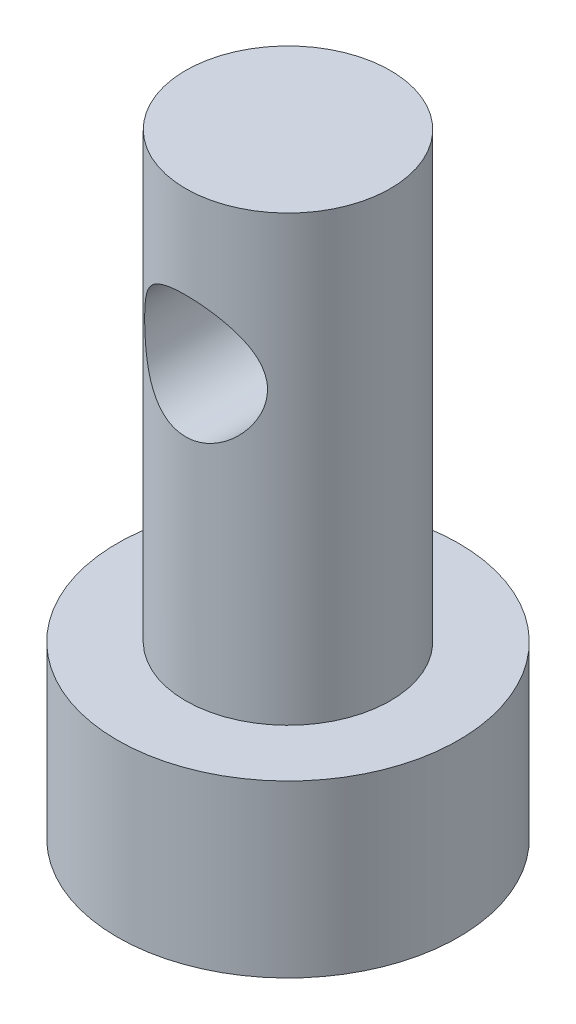
ISO-10303-21;
HEADER;
FILE_DESCRIPTION(('STEP AP214'),'2;1');
FILE_NAME('part.step','',(''),(''),'','','');
FILE_SCHEMA(('AUTOMOTIVE_DESIGN { 1 0 10303 214 1 1 1 1 }'));
ENDSEC;
DATA;
#1=APPLICATION_CONTEXT('core data for automotive mechanical design processes');
#2=APPLICATION_PROTOCOL_DEFINITION('international standard','automotive_design',2000,#1);
#3=PRODUCT_CONTEXT('',#1,'mechanical');
#4=PRODUCT('Part','Part','',(#3));
#5=PRODUCT_RELATED_PRODUCT_CATEGORY('part','',(#4));
#6=PRODUCT_DEFINITION_FORMATION('','',#4);
#7=PRODUCT_DEFINITION_CONTEXT('part definition',#1,'design');
#8=PRODUCT_DEFINITION('design','',#6,#7);
#9=PRODUCT_DEFINITION_SHAPE('','',#8);
#10=(LENGTH_UNIT() NAMED_UNIT(*) SI_UNIT(.MILLI.,.METRE.));
#11=(NAMED_UNIT(*) PLANE_ANGLE_UNIT() SI_UNIT($,.RADIAN.));
#12=(NAMED_UNIT(*) SI_UNIT($,.STERADIAN.) SOLID_ANGLE_UNIT());
#13=UNCERTAINTY_MEASURE_WITH_UNIT(LENGTH_MEASURE(1.E-05),#10,'distance_accuracy_value','');
#14=(GEOMETRIC_REPRESENTATION_CONTEXT(3) GLOBAL_UNCERTAINTY_ASSIGNED_CONTEXT((#13)) GLOBAL_UNIT_ASSIGNED_CONTEXT((#10,
#11,#12)) REPRESENTATION_CONTEXT('',''));
#15=CARTESIAN_POINT('',(0.,0.,0.));
#16=DIRECTION('',(0.,0.,1.));
#17=DIRECTION('',(1.,0.,0.));
#18=AXIS2_PLACEMENT_3D('',#15,#16,#17);
#19=CARTESIAN_POINT('',(0.,5.,0.));
#20=DIRECTION('',(0.,-1.,0.));
#21=DIRECTION('',(0.,0.,-1.));
#22=AXIS2_PLACEMENT_3D('',#19,#20,#21);
#23=CYLINDRICAL_SURFACE('',#22,5.);
#24=CARTESIAN_POINT('',(0.,5.,0.));
#25=DIRECTION('',(0.,1.,0.));
#26=DIRECTION('',(0.,0.,1.));
#27=AXIS2_PLACEMENT_3D('',#24,#25,#26);
#28=CIRCLE('',#27,5.);
#29=CARTESIAN_POINT('',(0.,5.,5.));
#30=VERTEX_POINT('',#29);
#31=EDGE_CURVE('E45',#30,#30,#28,.T.);
#32=ORIENTED_EDGE('',*,*,#31,.F.);
#33=EDGE_LOOP('',(#32));
#34=FACE_BOUND('',#33,.T.);
#35=CARTESIAN_POINT('',(0.,0.,0.));
#36=DIRECTION('',(0.,1.,0.));
#37=DIRECTION('',(0.,0.,1.));
#38=AXIS2_PLACEMENT_3D('',#35,#36,#37);
#39=CIRCLE('',#38,5.);
#40=CARTESIAN_POINT('',(0.,0.,5.));
#41=VERTEX_POINT('',#40);
#42=EDGE_CURVE('E50',#41,#41,#39,.T.);
#43=ORIENTED_EDGE('',*,*,#42,.T.);
#44=EDGE_LOOP('',(#43));
#45=FACE_BOUND('',#44,.T.);
#46=ADVANCED_FACE('F33',(#34,#45),#23,.T.);
#47=CARTESIAN_POINT('',(0.,5.,0.));
#48=DIRECTION('',(0.,1.,0.));
#49=DIRECTION('',(0.,0.,1.));
#50=AXIS2_PLACEMENT_3D('',#47,#48,#49);
#51=PLANE('',#50);
#52=CARTESIAN_POINT('',(0.,5.,0.));
#53=DIRECTION('',(0.,1.,0.));
#54=DIRECTION('',(0.,0.,1.));
#55=AXIS2_PLACEMENT_3D('',#52,#53,#54);
#56=CIRCLE('',#55,3.);
#57=CARTESIAN_POINT('',(0.,5.,3.));
#58=VERTEX_POINT('',#57);
#59=EDGE_CURVE('E10',#58,#58,#56,.T.);
#60=ORIENTED_EDGE('',*,*,#59,.F.);
#61=EDGE_LOOP('',(#60));
#62=FACE_BOUND('',#61,.T.);
#63=ORIENTED_EDGE('',*,*,#31,.T.);
#64=EDGE_LOOP('',(#63));
#65=FACE_BOUND('',#64,.T.);
#66=ADVANCED_FACE('F93',(#62,#65),#51,.T.);
#67=CARTESIAN_POINT('',(0.,0.,0.));
#68=DIRECTION('',(0.,1.,0.));
#69=DIRECTION('',(0.,0.,1.));
#70=AXIS2_PLACEMENT_3D('',#67,#68,#69);
#71=PLANE('',#70);
#72=CARTESIAN_POINT('',(0.,0.,0.));
#73=DIRECTION('',(0.,-1.,0.));
#74=DIRECTION('',(0.,0.,-1.));
#75=AXIS2_PLACEMENT_3D('',#72,#73,#74);
#76=CIRCLE('',#75,1.9);
#77=CARTESIAN_POINT('',(0.,0.,-1.9));
#78=VERTEX_POINT('',#77);
#79=EDGE_CURVE('E63',#78,#78,#76,.T.);
#80=ORIENTED_EDGE('',*,*,#79,.F.);
#81=EDGE_LOOP('',(#80));
#82=FACE_BOUND('',#81,.T.);
#83=ORIENTED_EDGE('',*,*,#42,.F.);
#84=EDGE_LOOP('',(#83));
#85=FACE_BOUND('',#84,.T.);
#86=ADVANCED_FACE('F98',(#82,#85),#71,.F.);
#87=CARTESIAN_POINT('',(0.,18.,0.));
#88=DIRECTION('',(0.,-1.,0.));
#89=DIRECTION('',(0.,0.,-1.));
#90=AXIS2_PLACEMENT_3D('',#87,#88,#89);
#91=CYLINDRICAL_SURFACE('',#90,3.);
#92=CARTESIAN_POINT('',(1.8,13.5,2.4));
#93=CARTESIAN_POINT('',(1.8000048493031,13.4094252296524,2.39999299971014));
#94=CARTESIAN_POINT('',(1.79312223388816,13.3188738791042,2.40520360684178));
#95=CARTESIAN_POINT('',(1.76609958183345,13.1408113152453,2.42511108736659));
#96=CARTESIAN_POINT('',(1.74594570946723,13.0533033751379,2.43981786051717));
#97=CARTESIAN_POINT('',(1.69372183602954,12.8842996299873,2.47634806841676));
#98=CARTESIAN_POINT('',(1.6617378540378,12.8027653943577,2.49811999419744));
#99=CARTESIAN_POINT('',(1.58703491139623,12.6462750559585,2.54623085995003));
#100=CARTESIAN_POINT('',(1.54431274865632,12.5713209243658,2.57257116146899));
#101=CARTESIAN_POINT('',(1.44325551297173,12.4200611800031,2.63074313505051));
#102=CARTESIAN_POINT('',(1.38365015322347,12.3447108514513,2.66285245245195));
#103=CARTESIAN_POINT('',(1.25312161571982,12.2042822847099,2.72671475317273));
#104=CARTESIAN_POINT('',(1.18218995607554,12.139211817995,2.75846745020523));
#105=CARTESIAN_POINT('',(1.02173084089404,12.0142394283484,2.8221068143048));
#106=CARTESIAN_POINT('',(0.931022394195058,11.9556546435963,2.85363760293381));
#107=CARTESIAN_POINT('',(0.738785073925991,11.8550283330667,2.90932544379815));
#108=CARTESIAN_POINT('',(0.637266235951597,11.8129716310527,2.93348925586482));
#109=CARTESIAN_POINT('',(0.4365256880912,11.7508848926248,2.96965185360528));
#110=CARTESIAN_POINT('',(0.338009637757099,11.7291355668392,2.98259164727004));
#111=CARTESIAN_POINT('',(0.137964611259251,11.7024686365643,2.99849927133054));
#112=CARTESIAN_POINT('',(0.0364385548801852,11.6975352263999,3.00147646575969));
#113=CARTESIAN_POINT('',(-0.153164740484771,11.704336496811,2.99740047253846));
#114=CARTESIAN_POINT('',(-0.241348599438761,11.7140802314032,2.99154525016471));
#115=CARTESIAN_POINT('',(-0.414557122982121,11.7461757547777,2.97249597064629));
#116=CARTESIAN_POINT('',(-0.499581553261441,11.7685284766886,2.95930137035171));
#117=CARTESIAN_POINT('',(-0.664868136562895,11.8249986752445,2.92661888642063));
#118=CARTESIAN_POINT('',(-0.74509978924514,11.8591836733668,2.90709492540989));
#119=CARTESIAN_POINT('',(-0.898786392138732,11.9380615394707,2.86331565166498));
#120=CARTESIAN_POINT('',(-0.972239575449612,11.9827571364708,2.83905911042174));
#121=CARTESIAN_POINT('',(-1.11968912057184,12.0874069113653,2.78445511171635));
#122=CARTESIAN_POINT('',(-1.19270239583783,12.1485459740829,2.7537261954258));
#123=CARTESIAN_POINT('',(-1.32805759091129,12.2812849414322,2.69106665094721));
#124=CARTESIAN_POINT('',(-1.39038481570007,12.3528990041694,2.6591344404405));
#125=CARTESIAN_POINT('',(-1.50989805320901,12.5143840873963,2.59333290148735));
#126=CARTESIAN_POINT('',(-1.56565119826358,12.6054090918474,2.55966793662149));
#127=CARTESIAN_POINT('',(-1.66076660633078,12.7976474779639,2.49901055468721));
#128=CARTESIAN_POINT('',(-1.70015906354626,12.8988416593508,2.47200588358585));
#129=CARTESIAN_POINT('',(-1.75292996477811,13.0828723582744,2.43475038236078));
#130=CARTESIAN_POINT('',(-1.77033483975198,13.164048758756,2.42200666341979));
#131=CARTESIAN_POINT('',(-1.79377047306341,13.3288483323594,2.4047058093307));
#132=CARTESIAN_POINT('',(-1.79981445963488,13.4124685445815,2.4001391533814));
#133=CARTESIAN_POINT('',(-1.80017737337019,13.5798620189229,2.39986697185588));
#134=CARTESIAN_POINT('',(-1.7944800563719,13.6636353326583,2.40417372268781));
#135=CARTESIAN_POINT('',(-1.77168348689929,13.8287848124983,2.42101824946383));
#136=CARTESIAN_POINT('',(-1.75457522196167,13.9101590306883,2.43356253135856));
#137=CARTESIAN_POINT('',(-1.70985975142388,14.0684574953757,2.46518121999721));
#138=CARTESIAN_POINT('',(-1.68226566308834,14.1453871638387,2.48424746511374));
#139=CARTESIAN_POINT('',(-1.61755513268487,14.2937732588762,2.52685847301104));
#140=CARTESIAN_POINT('',(-1.58043509865855,14.3652276076392,2.55040492427999));
#141=CARTESIAN_POINT('',(-1.49000927470214,14.5142880990147,2.60444183013284));
#142=CARTESIAN_POINT('',(-1.43499195672363,14.5906810021159,2.63541887276843));
#143=CARTESIAN_POINT('',(-1.31384874622441,14.7339425818194,2.69786105764345));
#144=CARTESIAN_POINT('',(-1.24771222406882,14.8008020306029,2.72932664053746));
#145=CARTESIAN_POINT('',(-1.09592980465532,14.9318688088205,2.79402751093096));
#146=CARTESIAN_POINT('',(-1.00886533053623,14.994600871927,2.82696091051044));
#147=CARTESIAN_POINT('',(-0.823323721041621,15.104283332204,2.88645166960151));
#148=CARTESIAN_POINT('',(-0.72485421136164,15.1512441934091,2.91301325339293));
#149=CARTESIAN_POINT('',(-0.526608279566563,15.2242418441176,2.9550273611133));
#150=CARTESIAN_POINT('',(-0.427447156381508,15.2515514733493,2.97114705680795));
#151=CARTESIAN_POINT('',(-0.224859676669027,15.2888575234155,2.9932888668732));
#152=CARTESIAN_POINT('',(-0.12143828613836,15.2988735488611,2.99932241499285));
#153=CARTESIAN_POINT('',(0.071774427841183,15.3008095303031,3.00048720554371));
#154=CARTESIAN_POINT('',(0.16154470030765,15.2949640014756,2.99696468623592));
#155=CARTESIAN_POINT('',(0.33857850717453,15.2701274107421,2.98215538094515));
#156=CARTESIAN_POINT('',(0.425842013642298,15.2511362024141,2.97086850847967));
#157=CARTESIAN_POINT('',(0.594174578374558,15.2013365140995,2.94179313032354));
#158=CARTESIAN_POINT('',(0.675320439130599,15.1707220846449,2.92411160230687));
#159=CARTESIAN_POINT('',(0.831338366399984,15.0988312865343,2.88364004936586));
#160=CARTESIAN_POINT('',(0.906209021039801,15.0575525269685,2.86084887902721));
#161=CARTESIAN_POINT('',(1.05631637435514,14.9604897641175,2.80912119191257));
#162=CARTESIAN_POINT('',(1.13071042852793,14.9036175491798,2.77978613566979));
#163=CARTESIAN_POINT('',(1.26947701843568,14.7794963595387,2.71922288820793));
#164=CARTESIAN_POINT('',(1.33383829148299,14.7122358892705,2.68799262329411));
#165=CARTESIAN_POINT('',(1.45909170420684,14.5592573253868,2.62233798799445));
#166=CARTESIAN_POINT('',(1.51850887996041,14.4722802166014,2.58801079525081));
#167=CARTESIAN_POINT('',(1.6218818065239,14.2878181766801,2.52451757382174));
#168=CARTESIAN_POINT('',(1.66584559587193,14.1903387432223,2.49534886573262));
#169=CARTESIAN_POINT('',(1.73324539842158,13.9955228578354,2.44896003657552));
#170=CARTESIAN_POINT('',(1.75811431272225,13.8988857168465,2.43093198996166));
#171=CARTESIAN_POINT('',(1.79147121888512,13.7014831263556,2.40646838784043));
#172=CARTESIAN_POINT('',(1.79999460715004,13.6007270810895,2.40000778493572));
#173=CARTESIAN_POINT('',(1.8,13.5,2.4));
#174=B_SPLINE_CURVE_WITH_KNOTS('',3,(#92,#93,#94,#95,#96,#97,#98,#99,#100,#101,#102,#103,#104,
#105,#106,#107,#108,#109,#110,#111,#112,#113,#114,#115,#116,#117,#118,#119,#120,#121,#122,#123,
#124,#125,#126,#127,#128,#129,#130,#131,#132,#133,#134,#135,#136,#137,#138,#139,#140,#141,#142,
#143,#144,#145,#146,#147,#148,#149,#150,#151,#152,#153,#154,#155,#156,#157,#158,#159,#160,#161,
#162,#163,#164,#165,#166,#167,#168,#169,#170,#171,#172,#173),.UNSPECIFIED.,.T.,.F.,(4,2,2,2,2,2,
2,2,2,2,2,2,2,2,2,2,2,2,2,2,2,2,2,2,2,2,2,2,2,2,2,2,2,2,2,2,2,2,2,2,4),(0.,0.27130229939207,
0.542887889196923,0.81253634999025,1.08226531465912,1.38497354868001,1.68790954322212,
2.02356189283467,2.35890531925464,2.66223997030196,2.9652894312332,3.23076156651818,
3.49625335065533,3.76328586043652,4.03038778042654,4.32939372067018,4.6288075998829,
4.96292005368331,5.29641312185721,5.5473155766562,5.79792570772771,6.04888279213417,
6.30003831964953,6.55088069238594,6.80181778985593,7.09799326178403,7.39445349574145,
7.72946193613906,8.06424766061817,8.37469775260004,8.68479567627271,8.95355186219278,
9.22231104167577,9.48676764226507,9.75128358473501,10.0445155625938,10.3380743849035,
10.6688603491992,10.9994739898177,11.3018414416122,11.6035533709473),.UNSPECIFIED.);
#175=CARTESIAN_POINT('',(1.8,13.5,2.4));
#176=VERTEX_POINT('',#175);
#177=EDGE_CURVE('E36',#176,#176,#174,.T.);
#178=ORIENTED_EDGE('',*,*,#177,.T.);
#179=EDGE_LOOP('',(#178));
#180=FACE_BOUND('',#179,.T.);
#181=CARTESIAN_POINT('',(0.,18.,0.));
#182=DIRECTION('',(0.,1.,0.));
#183=DIRECTION('',(0.,0.,1.));
#184=AXIS2_PLACEMENT_3D('',#181,#182,#183);
#185=CIRCLE('',#184,3.);
#186=CARTESIAN_POINT('',(0.,18.,3.));
#187=VERTEX_POINT('',#186);
#188=EDGE_CURVE('E53',#187,#187,#185,.T.);
#189=ORIENTED_EDGE('',*,*,#188,.F.);
#190=EDGE_LOOP('',(#189));
#191=FACE_BOUND('',#190,.T.);
#192=ORIENTED_EDGE('',*,*,#59,.T.);
#193=EDGE_LOOP('',(#192));
#194=FACE_BOUND('',#193,.T.);
#195=ADVANCED_FACE('F76',(#180,#191,#194),#91,.T.);
#196=CARTESIAN_POINT('',(0.,18.,0.));
#197=DIRECTION('',(0.,1.,0.));
#198=DIRECTION('',(0.,0.,1.));
#199=AXIS2_PLACEMENT_3D('',#196,#197,#198);
#200=PLANE('',#199);
#201=ORIENTED_EDGE('',*,*,#188,.T.);
#202=EDGE_LOOP('',(#201));
#203=FACE_BOUND('',#202,.T.);
#204=ADVANCED_FACE('F110',(#203),#200,.T.);
#205=CARTESIAN_POINT('',(0.,10.,0.));
#206=DIRECTION('',(0.,-1.,0.));
#207=DIRECTION('',(0.,0.,-1.));
#208=AXIS2_PLACEMENT_3D('',#205,#206,#207);
#209=CYLINDRICAL_SURFACE('',#208,1.9);
#210=CARTESIAN_POINT('',(0.,10.,0.));
#211=DIRECTION('',(0.,-1.,0.));
#212=DIRECTION('',(0.,0.,-1.));
#213=AXIS2_PLACEMENT_3D('',#210,#211,#212);
#214=CIRCLE('',#213,1.9);
#215=CARTESIAN_POINT('',(0.,10.,-1.9));
#216=VERTEX_POINT('',#215);
#217=EDGE_CURVE('E59',#216,#216,#214,.T.);
#218=ORIENTED_EDGE('',*,*,#217,.F.);
#219=EDGE_LOOP('',(#218));
#220=FACE_BOUND('',#219,.T.);
#221=ORIENTED_EDGE('',*,*,#79,.T.);
#222=EDGE_LOOP('',(#221));
#223=FACE_BOUND('',#222,.T.);
#224=ADVANCED_FACE('F89',(#220,#223),#209,.F.);
#225=CARTESIAN_POINT('',(0.,10.,0.));
#226=DIRECTION('',(0.,-1.,0.));
#227=DIRECTION('',(0.,0.,-1.));
#228=AXIS2_PLACEMENT_3D('',#225,#226,#227);
#229=PLANE('',#228);
#230=ORIENTED_EDGE('',*,*,#217,.T.);
#231=EDGE_LOOP('',(#230));
#232=FACE_BOUND('',#231,.T.);
#233=ADVANCED_FACE('F82',(#232),#229,.T.);
#234=CARTESIAN_POINT('',(0.,13.5,-0.4));
#235=DIRECTION('',(0.,0.,1.));
#236=DIRECTION('',(1.,0.,0.));
#237=AXIS2_PLACEMENT_3D('',#234,#235,#236);
#238=CYLINDRICAL_SURFACE('',#237,1.8);
#239=CARTESIAN_POINT('',(0.,13.5,-0.4));
#240=DIRECTION('',(0.,0.,1.));
#241=DIRECTION('',(1.,0.,0.));
#242=AXIS2_PLACEMENT_3D('',#239,#240,#241);
#243=CIRCLE('',#242,1.8);
#244=CARTESIAN_POINT('',(1.8,13.5,-0.4));
#245=VERTEX_POINT('',#244);
#246=EDGE_CURVE('E69',#245,#245,#243,.T.);
#247=ORIENTED_EDGE('',*,*,#246,.F.);
#248=EDGE_LOOP('',(#247));
#249=FACE_BOUND('',#248,.T.);
#250=ORIENTED_EDGE('',*,*,#177,.F.);
#251=EDGE_LOOP('',(#250));
#252=FACE_BOUND('',#251,.T.);
#253=ADVANCED_FACE('F79',(#249,#252),#238,.F.);
#254=CARTESIAN_POINT('',(0.,13.5,-0.4));
#255=DIRECTION('',(0.,0.,1.));
#256=DIRECTION('',(1.,0.,0.));
#257=AXIS2_PLACEMENT_3D('',#254,#255,#256);
#258=PLANE('',#257);
#259=ORIENTED_EDGE('',*,*,#246,.T.);
#260=EDGE_LOOP('',(#259));
#261=FACE_BOUND('',#260,.T.);
#262=ADVANCED_FACE('F81',(#261),#258,.T.);
#263=CLOSED_SHELL('',(#46,#66,#86,#195,#204,#224,#233,#253,#262));
#264=MANIFOLD_SOLID_BREP('B2',#263);
#265=ADVANCED_BREP_SHAPE_REPRESENTATION('',(#18,#264),#14);
#266=SHAPE_DEFINITION_REPRESENTATION(#9,#265);
ENDSEC;
END-ISO-10303-21;
